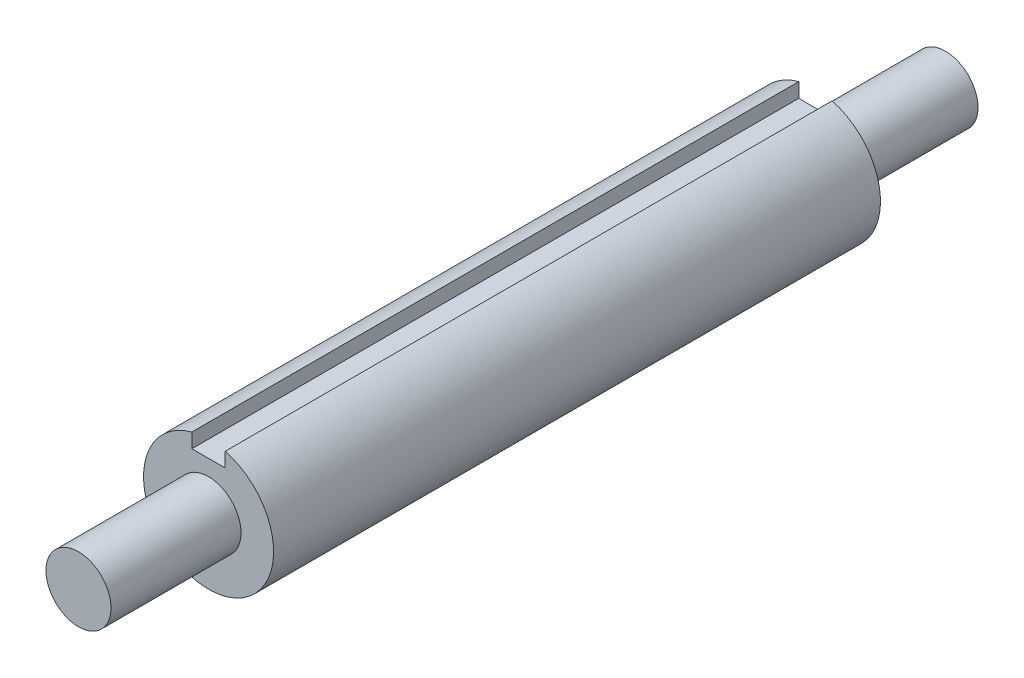
ISO-10303-21;
HEADER;
FILE_DESCRIPTION(('STEP AP214'),'2;1');
FILE_NAME('part.step','',(''),(''),'','','');
FILE_SCHEMA(('AUTOMOTIVE_DESIGN { 1 0 10303 214 1 1 1 1 }'));
ENDSEC;
DATA;
#1=APPLICATION_CONTEXT('core data for automotive mechanical design processes');
#2=APPLICATION_PROTOCOL_DEFINITION('international standard','automotive_design',2000,#1);
#3=PRODUCT_CONTEXT('',#1,'mechanical');
#4=PRODUCT('Part','Part','',(#3));
#5=PRODUCT_RELATED_PRODUCT_CATEGORY('part','',(#4));
#6=PRODUCT_DEFINITION_FORMATION('','',#4);
#7=PRODUCT_DEFINITION_CONTEXT('part definition',#1,'design');
#8=PRODUCT_DEFINITION('design','',#6,#7);
#9=PRODUCT_DEFINITION_SHAPE('','',#8);
#10=(LENGTH_UNIT() NAMED_UNIT(*) SI_UNIT(.MILLI.,.METRE.));
#11=(NAMED_UNIT(*) PLANE_ANGLE_UNIT() SI_UNIT($,.RADIAN.));
#12=(NAMED_UNIT(*) SI_UNIT($,.STERADIAN.) SOLID_ANGLE_UNIT());
#13=UNCERTAINTY_MEASURE_WITH_UNIT(LENGTH_MEASURE(1.E-05),#10,'distance_accuracy_value','');
#14=(GEOMETRIC_REPRESENTATION_CONTEXT(3) GLOBAL_UNCERTAINTY_ASSIGNED_CONTEXT((#13)) GLOBAL_UNIT_ASSIGNED_CONTEXT((#10,
#11,#12)) REPRESENTATION_CONTEXT('',''));
#15=CARTESIAN_POINT('',(0.,0.,0.));
#16=DIRECTION('',(0.,0.,1.));
#17=DIRECTION('',(1.,0.,0.));
#18=AXIS2_PLACEMENT_3D('',#15,#16,#17);
#19=CARTESIAN_POINT('',(0.,0.,85.));
#20=DIRECTION('',(0.,0.,-1.));
#21=DIRECTION('',(-1.,0.,0.));
#22=AXIS2_PLACEMENT_3D('',#19,#20,#21);
#23=CYLINDRICAL_SURFACE('',#22,7.5);
#24=CARTESIAN_POINT('',(0.,0.,85.));
#25=DIRECTION('',(0.,0.,-1.));
#26=DIRECTION('',(-1.,0.,0.));
#27=AXIS2_PLACEMENT_3D('',#24,#25,#26);
#28=CIRCLE('',#27,7.5);
#29=CARTESIAN_POINT('',(1.925,7.2487498922228,85.));
#30=VERTEX_POINT('',#29);
#31=CARTESIAN_POINT('',(-1.925,7.2487498922228,85.));
#32=VERTEX_POINT('',#31);
#33=EDGE_CURVE('E108',#30,#32,#28,.T.);
#34=ORIENTED_EDGE('',*,*,#33,.T.);
#35=DIRECTION('',(0.,0.,-1.));
#36=VECTOR('',#35,1.);
#37=CARTESIAN_POINT('',(-1.925,7.2487498922228,85.));
#38=LINE('',#37,#36);
#39=CARTESIAN_POINT('',(-1.925,7.2487498922228,15.));
#40=VERTEX_POINT('',#39);
#41=EDGE_CURVE('E109',#32,#40,#38,.T.);
#42=ORIENTED_EDGE('',*,*,#41,.T.);
#43=CARTESIAN_POINT('',(0.,0.,15.));
#44=DIRECTION('',(0.,0.,-1.));
#45=DIRECTION('',(-1.,0.,0.));
#46=AXIS2_PLACEMENT_3D('',#43,#44,#45);
#47=CIRCLE('',#46,7.5);
#48=CARTESIAN_POINT('',(1.925,7.2487498922228,15.));
#49=VERTEX_POINT('',#48);
#50=EDGE_CURVE('E105',#49,#40,#47,.T.);
#51=ORIENTED_EDGE('',*,*,#50,.F.);
#52=DIRECTION('',(0.,0.,-1.));
#53=VECTOR('',#52,1.);
#54=CARTESIAN_POINT('',(1.925,7.2487498922228,85.));
#55=LINE('',#54,#53);
#56=EDGE_CURVE('E61',#30,#49,#55,.T.);
#57=ORIENTED_EDGE('',*,*,#56,.F.);
#58=EDGE_LOOP('',(#34,#42,#51,#57));
#59=FACE_BOUND('',#58,.T.);
#60=ADVANCED_FACE('F45',(#59),#23,.T.);
#61=CARTESIAN_POINT('',(0.,0.,85.));
#62=DIRECTION('',(0.,0.,-1.));
#63=DIRECTION('',(-1.,0.,0.));
#64=AXIS2_PLACEMENT_3D('',#61,#62,#63);
#65=PLANE('',#64);
#66=CARTESIAN_POINT('',(0.,0.,85.));
#67=DIRECTION('',(0.,0.,-1.));
#68=DIRECTION('',(-1.,0.,0.));
#69=AXIS2_PLACEMENT_3D('',#66,#67,#68);
#70=CIRCLE('',#69,3.75);
#71=CARTESIAN_POINT('',(-3.75,0.,85.));
#72=VERTEX_POINT('',#71);
#73=EDGE_CURVE('E123',#72,#72,#70,.T.);
#74=ORIENTED_EDGE('',*,*,#73,.T.);
#75=EDGE_LOOP('',(#74));
#76=FACE_BOUND('',#75,.T.);
#77=DIRECTION('',(0.,1.,0.));
#78=VECTOR('',#77,1.);
#79=CARTESIAN_POINT('',(-1.925,9.425,85.));
#80=LINE('',#79,#78);
#81=CARTESIAN_POINT('',(-1.925,5.575,85.));
#82=VERTEX_POINT('',#81);
#83=EDGE_CURVE('E87',#82,#32,#80,.T.);
#84=ORIENTED_EDGE('',*,*,#83,.T.);
#85=ORIENTED_EDGE('',*,*,#33,.F.);
#86=DIRECTION('',(0.,1.,0.));
#87=VECTOR('',#86,1.);
#88=CARTESIAN_POINT('',(1.925,9.425,85.));
#89=LINE('',#88,#87);
#90=CARTESIAN_POINT('',(1.925,5.575,85.));
#91=VERTEX_POINT('',#90);
#92=EDGE_CURVE('E136',#91,#30,#89,.T.);
#93=ORIENTED_EDGE('',*,*,#92,.F.);
#94=DIRECTION('',(1.,0.,0.));
#95=VECTOR('',#94,1.);
#96=CARTESIAN_POINT('',(1.925,5.575,85.));
#97=LINE('',#96,#95);
#98=EDGE_CURVE('E91',#82,#91,#97,.T.);
#99=ORIENTED_EDGE('',*,*,#98,.F.);
#100=EDGE_LOOP('',(#84,#85,#93,#99));
#101=FACE_BOUND('',#100,.T.);
#102=ADVANCED_FACE('F141',(#76,#101),#65,.F.);
#103=CARTESIAN_POINT('',(0.,0.,15.));
#104=DIRECTION('',(0.,0.,-1.));
#105=DIRECTION('',(-1.,0.,0.));
#106=AXIS2_PLACEMENT_3D('',#103,#104,#105);
#107=PLANE('',#106);
#108=CARTESIAN_POINT('',(0.,0.,15.));
#109=DIRECTION('',(0.,0.,-1.));
#110=DIRECTION('',(-1.,0.,0.));
#111=AXIS2_PLACEMENT_3D('',#108,#109,#110);
#112=CIRCLE('',#111,3.75);
#113=CARTESIAN_POINT('',(-3.75,0.,15.));
#114=VERTEX_POINT('',#113);
#115=EDGE_CURVE('E114',#114,#114,#112,.T.);
#116=ORIENTED_EDGE('',*,*,#115,.F.);
#117=EDGE_LOOP('',(#116));
#118=FACE_BOUND('',#117,.T.);
#119=ORIENTED_EDGE('',*,*,#50,.T.);
#120=DIRECTION('',(0.,-1.,0.));
#121=VECTOR('',#120,1.);
#122=CARTESIAN_POINT('',(-1.925,0.,15.));
#123=LINE('',#122,#121);
#124=CARTESIAN_POINT('',(-1.925,5.575,15.));
#125=VERTEX_POINT('',#124);
#126=EDGE_CURVE('E11',#40,#125,#123,.T.);
#127=ORIENTED_EDGE('',*,*,#126,.T.);
#128=DIRECTION('',(-1.,0.,0.));
#129=VECTOR('',#128,1.);
#130=CARTESIAN_POINT('',(1.925,5.575,15.));
#131=LINE('',#130,#129);
#132=CARTESIAN_POINT('',(1.925,5.575,15.));
#133=VERTEX_POINT('',#132);
#134=EDGE_CURVE('E96',#133,#125,#131,.T.);
#135=ORIENTED_EDGE('',*,*,#134,.F.);
#136=DIRECTION('',(0.,-1.,0.));
#137=VECTOR('',#136,1.);
#138=CARTESIAN_POINT('',(1.925,0.,15.));
#139=LINE('',#138,#137);
#140=EDGE_CURVE('E54',#49,#133,#139,.T.);
#141=ORIENTED_EDGE('',*,*,#140,.F.);
#142=EDGE_LOOP('',(#119,#127,#135,#141));
#143=FACE_BOUND('',#142,.T.);
#144=ADVANCED_FACE('F103',(#118,#143),#107,.T.);
#145=CARTESIAN_POINT('',(0.,0.,100.));
#146=DIRECTION('',(0.,0.,-1.));
#147=DIRECTION('',(-1.,0.,0.));
#148=AXIS2_PLACEMENT_3D('',#145,#146,#147);
#149=CYLINDRICAL_SURFACE('',#148,3.75);
#150=CARTESIAN_POINT('',(0.,0.,100.));
#151=DIRECTION('',(0.,0.,1.));
#152=DIRECTION('',(1.,0.,0.));
#153=AXIS2_PLACEMENT_3D('',#150,#151,#152);
#154=CIRCLE('',#153,3.75);
#155=CARTESIAN_POINT('',(3.75,0.,100.));
#156=VERTEX_POINT('',#155);
#157=EDGE_CURVE('E119',#156,#156,#154,.T.);
#158=ORIENTED_EDGE('',*,*,#157,.F.);
#159=EDGE_LOOP('',(#158));
#160=FACE_BOUND('',#159,.T.);
#161=ORIENTED_EDGE('',*,*,#73,.F.);
#162=EDGE_LOOP('',(#161));
#163=FACE_BOUND('',#162,.T.);
#164=ADVANCED_FACE('F162',(#160,#163),#149,.T.);
#165=CARTESIAN_POINT('',(0.,0.,100.));
#166=DIRECTION('',(0.,0.,1.));
#167=DIRECTION('',(1.,0.,0.));
#168=AXIS2_PLACEMENT_3D('',#165,#166,#167);
#169=PLANE('',#168);
#170=ORIENTED_EDGE('',*,*,#157,.T.);
#171=EDGE_LOOP('',(#170));
#172=FACE_BOUND('',#171,.T.);
#173=ADVANCED_FACE('F159',(#172),#169,.T.);
#174=CARTESIAN_POINT('',(0.,0.,0.));
#175=DIRECTION('',(0.,0.,1.));
#176=DIRECTION('',(1.,0.,0.));
#177=AXIS2_PLACEMENT_3D('',#174,#175,#176);
#178=PLANE('',#177);
#179=CARTESIAN_POINT('',(0.,0.,0.));
#180=DIRECTION('',(0.,0.,1.));
#181=DIRECTION('',(1.,0.,0.));
#182=AXIS2_PLACEMENT_3D('',#179,#180,#181);
#183=CIRCLE('',#182,3.75);
#184=CARTESIAN_POINT('',(3.75,0.,0.));
#185=VERTEX_POINT('',#184);
#186=EDGE_CURVE('E124',#185,#185,#183,.T.);
#187=ORIENTED_EDGE('',*,*,#186,.F.);
#188=EDGE_LOOP('',(#187));
#189=FACE_BOUND('',#188,.T.);
#190=ADVANCED_FACE('F161',(#189),#178,.F.);
#191=ORIENTED_EDGE('',*,*,#115,.T.);
#192=EDGE_LOOP('',(#191));
#193=FACE_BOUND('',#192,.T.);
#194=ORIENTED_EDGE('',*,*,#186,.T.);
#195=EDGE_LOOP('',(#194));
#196=FACE_BOUND('',#195,.T.);
#197=ADVANCED_FACE('F47',(#193,#196),#149,.T.);
#198=CARTESIAN_POINT('',(-1.925,9.425,90.4447222151364));
#199=DIRECTION('',(1.,0.,0.));
#200=DIRECTION('',(0.,1.,0.));
#201=AXIS2_PLACEMENT_3D('',#198,#199,#200);
#202=PLANE('',#201);
#203=ORIENTED_EDGE('',*,*,#83,.F.);
#204=DIRECTION('',(0.,0.,-1.));
#205=VECTOR('',#204,1.);
#206=CARTESIAN_POINT('',(-1.925,5.575,90.4447222151364));
#207=LINE('',#206,#205);
#208=EDGE_CURVE('E83',#82,#125,#207,.T.);
#209=ORIENTED_EDGE('',*,*,#208,.T.);
#210=ORIENTED_EDGE('',*,*,#126,.F.);
#211=ORIENTED_EDGE('',*,*,#41,.F.);
#212=EDGE_LOOP('',(#203,#209,#210,#211));
#213=FACE_BOUND('',#212,.T.);
#214=ADVANCED_FACE('F85',(#213),#202,.T.);
#215=CARTESIAN_POINT('',(1.925,5.575,90.4447222151364));
#216=DIRECTION('',(0.,-1.,0.));
#217=DIRECTION('',(0.,0.,-1.));
#218=AXIS2_PLACEMENT_3D('',#215,#216,#217);
#219=PLANE('',#218);
#220=ORIENTED_EDGE('',*,*,#98,.T.);
#221=DIRECTION('',(0.,0.,-1.));
#222=VECTOR('',#221,1.);
#223=CARTESIAN_POINT('',(1.925,5.575,90.4447222151364));
#224=LINE('',#223,#222);
#225=EDGE_CURVE('E92',#91,#133,#224,.T.);
#226=ORIENTED_EDGE('',*,*,#225,.T.);
#227=ORIENTED_EDGE('',*,*,#134,.T.);
#228=ORIENTED_EDGE('',*,*,#208,.F.);
#229=EDGE_LOOP('',(#220,#226,#227,#228));
#230=FACE_BOUND('',#229,.T.);
#231=ADVANCED_FACE('F97',(#230),#219,.F.);
#232=CARTESIAN_POINT('',(1.925,9.425,90.4447222151364));
#233=DIRECTION('',(1.,0.,0.));
#234=DIRECTION('',(0.,1.,0.));
#235=AXIS2_PLACEMENT_3D('',#232,#233,#234);
#236=PLANE('',#235);
#237=ORIENTED_EDGE('',*,*,#56,.T.);
#238=ORIENTED_EDGE('',*,*,#140,.T.);
#239=ORIENTED_EDGE('',*,*,#225,.F.);
#240=ORIENTED_EDGE('',*,*,#92,.T.);
#241=EDGE_LOOP('',(#237,#238,#239,#240));
#242=FACE_BOUND('',#241,.T.);
#243=ADVANCED_FACE('F134',(#242),#236,.F.);
#244=CLOSED_SHELL('',(#60,#102,#144,#164,#173,#190,#197,#214,#231,#243));
#245=MANIFOLD_SOLID_BREP('B2',#244);
#246=ADVANCED_BREP_SHAPE_REPRESENTATION('',(#18,#245),#14);
#247=SHAPE_DEFINITION_REPRESENTATION(#9,#246);
ENDSEC;
END-ISO-10303-21;
